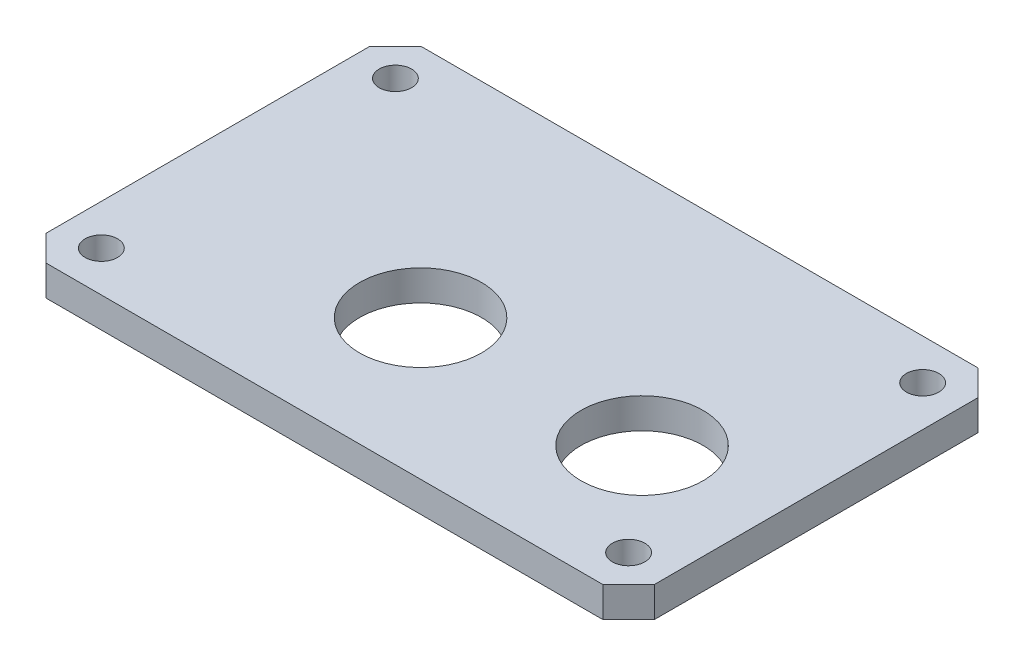
ISO-10303-21;
HEADER;
FILE_DESCRIPTION(('STEP AP214'),'2;1');
FILE_NAME('part.step','',(''),(''),'','','');
FILE_SCHEMA(('AUTOMOTIVE_DESIGN { 1 0 10303 214 1 1 1 1 }'));
ENDSEC;
DATA;
#1=APPLICATION_CONTEXT('core data for automotive mechanical design processes');
#2=APPLICATION_PROTOCOL_DEFINITION('international standard','automotive_design',2000,#1);
#3=PRODUCT_CONTEXT('',#1,'mechanical');
#4=PRODUCT('Part','Part','',(#3));
#5=PRODUCT_RELATED_PRODUCT_CATEGORY('part','',(#4));
#6=PRODUCT_DEFINITION_FORMATION('','',#4);
#7=PRODUCT_DEFINITION_CONTEXT('part definition',#1,'design');
#8=PRODUCT_DEFINITION('design','',#6,#7);
#9=PRODUCT_DEFINITION_SHAPE('','',#8);
#10=(LENGTH_UNIT() NAMED_UNIT(*) SI_UNIT(.MILLI.,.METRE.));
#11=(NAMED_UNIT(*) PLANE_ANGLE_UNIT() SI_UNIT($,.RADIAN.));
#12=(NAMED_UNIT(*) SI_UNIT($,.STERADIAN.) SOLID_ANGLE_UNIT());
#13=UNCERTAINTY_MEASURE_WITH_UNIT(LENGTH_MEASURE(1.E-05),#10,'distance_accuracy_value','');
#14=(GEOMETRIC_REPRESENTATION_CONTEXT(3) GLOBAL_UNCERTAINTY_ASSIGNED_CONTEXT((#13)) GLOBAL_UNIT_ASSIGNED_CONTEXT((#10,
#11,#12)) REPRESENTATION_CONTEXT('',''));
#15=CARTESIAN_POINT('',(0.,0.,0.));
#16=DIRECTION('',(0.,0.,1.));
#17=DIRECTION('',(1.,0.,0.));
#18=AXIS2_PLACEMENT_3D('',#15,#16,#17);
#19=CARTESIAN_POINT('',(30.,2.9972,18.5));
#20=DIRECTION('',(-1.,0.,0.));
#21=DIRECTION('',(0.,0.,1.));
#22=AXIS2_PLACEMENT_3D('',#19,#20,#21);
#23=PLANE('',#22);
#24=DIRECTION('',(0.,0.,-1.));
#25=VECTOR('',#24,1.);
#26=CARTESIAN_POINT('',(30.,0.,18.5));
#27=LINE('',#26,#25);
#28=CARTESIAN_POINT('',(30.,0.,15.96));
#29=VERTEX_POINT('',#28);
#30=CARTESIAN_POINT('',(30.,0.,-15.96));
#31=VERTEX_POINT('',#30);
#32=EDGE_CURVE('E126',#29,#31,#27,.T.);
#33=ORIENTED_EDGE('',*,*,#32,.T.);
#34=DIRECTION('',(0.,1.,0.));
#35=VECTOR('',#34,1.);
#36=CARTESIAN_POINT('',(30.,2.9972,-15.96));
#37=LINE('',#36,#35);
#38=CARTESIAN_POINT('',(30.,2.9972,-15.96));
#39=VERTEX_POINT('',#38);
#40=EDGE_CURVE('E104',#31,#39,#37,.T.);
#41=ORIENTED_EDGE('',*,*,#40,.T.);
#42=DIRECTION('',(0.,0.,-1.));
#43=VECTOR('',#42,1.);
#44=CARTESIAN_POINT('',(30.,2.9972,18.5));
#45=LINE('',#44,#43);
#46=CARTESIAN_POINT('',(30.,2.9972,15.96));
#47=VERTEX_POINT('',#46);
#48=EDGE_CURVE('E136',#47,#39,#45,.T.);
#49=ORIENTED_EDGE('',*,*,#48,.F.);
#50=DIRECTION('',(0.,-1.,0.));
#51=VECTOR('',#50,1.);
#52=CARTESIAN_POINT('',(30.,2.9972,15.96));
#53=LINE('',#52,#51);
#54=EDGE_CURVE('E109',#47,#29,#53,.T.);
#55=ORIENTED_EDGE('',*,*,#54,.T.);
#56=EDGE_LOOP('',(#33,#41,#49,#55));
#57=FACE_BOUND('',#56,.T.);
#58=ADVANCED_FACE('F33',(#57),#23,.F.);
#59=CARTESIAN_POINT('',(-30.,2.9972,-18.5));
#60=DIRECTION('',(0.,0.,1.));
#61=DIRECTION('',(1.,0.,0.));
#62=AXIS2_PLACEMENT_3D('',#59,#60,#61);
#63=PLANE('',#62);
#64=DIRECTION('',(-1.,0.,0.));
#65=VECTOR('',#64,1.);
#66=CARTESIAN_POINT('',(-30.,2.9972,-18.5));
#67=LINE('',#66,#65);
#68=CARTESIAN_POINT('',(27.46,2.9972,-18.5));
#69=VERTEX_POINT('',#68);
#70=CARTESIAN_POINT('',(-27.46,2.9972,-18.5));
#71=VERTEX_POINT('',#70);
#72=EDGE_CURVE('E119',#69,#71,#67,.T.);
#73=ORIENTED_EDGE('',*,*,#72,.F.);
#74=DIRECTION('',(0.,-1.,0.));
#75=VECTOR('',#74,1.);
#76=CARTESIAN_POINT('',(27.46,2.9972,-18.5));
#77=LINE('',#76,#75);
#78=CARTESIAN_POINT('',(27.46,0.,-18.5));
#79=VERTEX_POINT('',#78);
#80=EDGE_CURVE('E103',#69,#79,#77,.T.);
#81=ORIENTED_EDGE('',*,*,#80,.T.);
#82=DIRECTION('',(-1.,0.,0.));
#83=VECTOR('',#82,1.);
#84=CARTESIAN_POINT('',(-30.,0.,-18.5));
#85=LINE('',#84,#83);
#86=CARTESIAN_POINT('',(-27.46,0.,-18.5));
#87=VERTEX_POINT('',#86);
#88=EDGE_CURVE('E116',#79,#87,#85,.T.);
#89=ORIENTED_EDGE('',*,*,#88,.T.);
#90=DIRECTION('',(0.,1.,0.));
#91=VECTOR('',#90,1.);
#92=CARTESIAN_POINT('',(-27.46,2.9972,-18.5));
#93=LINE('',#92,#91);
#94=EDGE_CURVE('E121',#87,#71,#93,.T.);
#95=ORIENTED_EDGE('',*,*,#94,.T.);
#96=EDGE_LOOP('',(#73,#81,#89,#95));
#97=FACE_BOUND('',#96,.T.);
#98=ADVANCED_FACE('F115',(#97),#63,.F.);
#99=CARTESIAN_POINT('',(-30.,2.9972,18.5));
#100=DIRECTION('',(1.,0.,0.));
#101=DIRECTION('',(0.,0.,-1.));
#102=AXIS2_PLACEMENT_3D('',#99,#100,#101);
#103=PLANE('',#102);
#104=DIRECTION('',(0.,0.,1.));
#105=VECTOR('',#104,1.);
#106=CARTESIAN_POINT('',(-30.,0.,18.5));
#107=LINE('',#106,#105);
#108=CARTESIAN_POINT('',(-30.,0.,-15.96));
#109=VERTEX_POINT('',#108);
#110=CARTESIAN_POINT('',(-30.,0.,15.96));
#111=VERTEX_POINT('',#110);
#112=EDGE_CURVE('E125',#109,#111,#107,.T.);
#113=ORIENTED_EDGE('',*,*,#112,.T.);
#114=DIRECTION('',(0.,1.,0.));
#115=VECTOR('',#114,1.);
#116=CARTESIAN_POINT('',(-30.,2.9972,15.96));
#117=LINE('',#116,#115);
#118=CARTESIAN_POINT('',(-30.,2.9972,15.96));
#119=VERTEX_POINT('',#118);
#120=EDGE_CURVE('E11',#111,#119,#117,.T.);
#121=ORIENTED_EDGE('',*,*,#120,.T.);
#122=DIRECTION('',(0.,0.,1.));
#123=VECTOR('',#122,1.);
#124=CARTESIAN_POINT('',(-30.,2.9972,18.5));
#125=LINE('',#124,#123);
#126=CARTESIAN_POINT('',(-30.,2.9972,-15.96));
#127=VERTEX_POINT('',#126);
#128=EDGE_CURVE('E162',#127,#119,#125,.T.);
#129=ORIENTED_EDGE('',*,*,#128,.F.);
#130=DIRECTION('',(0.,-1.,0.));
#131=VECTOR('',#130,1.);
#132=CARTESIAN_POINT('',(-30.,2.9972,-15.96));
#133=LINE('',#132,#131);
#134=EDGE_CURVE('E41',#127,#109,#133,.T.);
#135=ORIENTED_EDGE('',*,*,#134,.T.);
#136=EDGE_LOOP('',(#113,#121,#129,#135));
#137=FACE_BOUND('',#136,.T.);
#138=ADVANCED_FACE('F160',(#137),#103,.F.);
#139=CARTESIAN_POINT('',(-30.,2.9972,18.5));
#140=DIRECTION('',(0.,0.,-1.));
#141=DIRECTION('',(-1.,0.,0.));
#142=AXIS2_PLACEMENT_3D('',#139,#140,#141);
#143=PLANE('',#142);
#144=DIRECTION('',(1.,0.,0.));
#145=VECTOR('',#144,1.);
#146=CARTESIAN_POINT('',(-30.,0.,18.5));
#147=LINE('',#146,#145);
#148=CARTESIAN_POINT('',(-27.46,0.,18.5));
#149=VERTEX_POINT('',#148);
#150=CARTESIAN_POINT('',(27.46,0.,18.5));
#151=VERTEX_POINT('',#150);
#152=EDGE_CURVE('E129',#149,#151,#147,.T.);
#153=ORIENTED_EDGE('',*,*,#152,.T.);
#154=DIRECTION('',(0.,1.,0.));
#155=VECTOR('',#154,1.);
#156=CARTESIAN_POINT('',(27.46,2.9972,18.5));
#157=LINE('',#156,#155);
#158=CARTESIAN_POINT('',(27.46,2.9972,18.5));
#159=VERTEX_POINT('',#158);
#160=EDGE_CURVE('E48',#151,#159,#157,.T.);
#161=ORIENTED_EDGE('',*,*,#160,.T.);
#162=DIRECTION('',(1.,0.,0.));
#163=VECTOR('',#162,1.);
#164=CARTESIAN_POINT('',(-30.,2.9972,18.5));
#165=LINE('',#164,#163);
#166=CARTESIAN_POINT('',(-27.46,2.9972,18.5));
#167=VERTEX_POINT('',#166);
#168=EDGE_CURVE('E137',#167,#159,#165,.T.);
#169=ORIENTED_EDGE('',*,*,#168,.F.);
#170=DIRECTION('',(0.,-1.,0.));
#171=VECTOR('',#170,1.);
#172=CARTESIAN_POINT('',(-27.46,2.9972,18.5));
#173=LINE('',#172,#171);
#174=EDGE_CURVE('E153',#167,#149,#173,.T.);
#175=ORIENTED_EDGE('',*,*,#174,.T.);
#176=EDGE_LOOP('',(#153,#161,#169,#175));
#177=FACE_BOUND('',#176,.T.);
#178=ADVANCED_FACE('F169',(#177),#143,.F.);
#179=CARTESIAN_POINT('',(30.,2.9972,-18.5));
#180=DIRECTION('',(0.,-1.,0.));
#181=DIRECTION('',(0.,0.,-1.));
#182=AXIS2_PLACEMENT_3D('',#179,#180,#181);
#183=PLANE('',#182);
#184=CARTESIAN_POINT('',(17.526,2.9972,4.699));
#185=DIRECTION('',(0.,1.,0.));
#186=DIRECTION('',(0.,0.,1.));
#187=AXIS2_PLACEMENT_3D('',#184,#185,#186);
#188=CIRCLE('',#187,6.0198);
#189=CARTESIAN_POINT('',(17.526,2.9972,10.7188));
#190=VERTEX_POINT('',#189);
#191=EDGE_CURVE('E206',#190,#190,#188,.T.);
#192=ORIENTED_EDGE('',*,*,#191,.F.);
#193=EDGE_LOOP('',(#192));
#194=FACE_BOUND('',#193,.T.);
#195=CARTESIAN_POINT('',(-4.318,2.9972,4.699));
#196=DIRECTION('',(0.,1.,0.));
#197=DIRECTION('',(0.,0.,1.));
#198=AXIS2_PLACEMENT_3D('',#195,#196,#197);
#199=CIRCLE('',#198,6.0198);
#200=CARTESIAN_POINT('',(-4.318,2.9972,10.7188));
#201=VERTEX_POINT('',#200);
#202=EDGE_CURVE('E200',#201,#201,#199,.T.);
#203=ORIENTED_EDGE('',*,*,#202,.F.);
#204=EDGE_LOOP('',(#203));
#205=FACE_BOUND('',#204,.T.);
#206=CARTESIAN_POINT('',(26.,2.9972,-14.5));
#207=DIRECTION('',(0.,1.,0.));
#208=DIRECTION('',(0.,0.,1.));
#209=AXIS2_PLACEMENT_3D('',#206,#207,#208);
#210=CIRCLE('',#209,1.6);
#211=CARTESIAN_POINT('',(26.,2.9972,-12.9));
#212=VERTEX_POINT('',#211);
#213=EDGE_CURVE('E194',#212,#212,#210,.T.);
#214=ORIENTED_EDGE('',*,*,#213,.F.);
#215=EDGE_LOOP('',(#214));
#216=FACE_BOUND('',#215,.T.);
#217=CARTESIAN_POINT('',(26.,2.9972,14.5));
#218=DIRECTION('',(0.,1.,0.));
#219=DIRECTION('',(0.,0.,1.));
#220=AXIS2_PLACEMENT_3D('',#217,#218,#219);
#221=CIRCLE('',#220,1.6);
#222=CARTESIAN_POINT('',(26.,2.9972,16.1));
#223=VERTEX_POINT('',#222);
#224=EDGE_CURVE('E188',#223,#223,#221,.T.);
#225=ORIENTED_EDGE('',*,*,#224,.F.);
#226=EDGE_LOOP('',(#225));
#227=FACE_BOUND('',#226,.T.);
#228=CARTESIAN_POINT('',(-26.,2.9972,14.5));
#229=DIRECTION('',(0.,1.,0.));
#230=DIRECTION('',(0.,0.,1.));
#231=AXIS2_PLACEMENT_3D('',#228,#229,#230);
#232=CIRCLE('',#231,1.6);
#233=CARTESIAN_POINT('',(-26.,2.9972,16.1));
#234=VERTEX_POINT('',#233);
#235=EDGE_CURVE('E182',#234,#234,#232,.T.);
#236=ORIENTED_EDGE('',*,*,#235,.F.);
#237=EDGE_LOOP('',(#236));
#238=FACE_BOUND('',#237,.T.);
#239=CARTESIAN_POINT('',(-26.,2.9972,-14.5));
#240=DIRECTION('',(0.,1.,0.));
#241=DIRECTION('',(0.,0.,1.));
#242=AXIS2_PLACEMENT_3D('',#239,#240,#241);
#243=CIRCLE('',#242,1.6);
#244=CARTESIAN_POINT('',(-26.,2.9972,-12.9));
#245=VERTEX_POINT('',#244);
#246=EDGE_CURVE('E176',#245,#245,#243,.T.);
#247=ORIENTED_EDGE('',*,*,#246,.F.);
#248=EDGE_LOOP('',(#247));
#249=FACE_BOUND('',#248,.T.);
#250=ORIENTED_EDGE('',*,*,#48,.T.);
#251=DIRECTION('',(0.707106781186545,0.,0.70710678118655));
#252=VECTOR('',#251,1.);
#253=CARTESIAN_POINT('',(27.46,2.9972,-18.5));
#254=LINE('',#253,#252);
#255=EDGE_CURVE('E151',#39,#69,#254,.F.);
#256=ORIENTED_EDGE('',*,*,#255,.T.);
#257=ORIENTED_EDGE('',*,*,#72,.T.);
#258=DIRECTION('',(0.707106781186549,0.,-0.707106781186547));
#259=VECTOR('',#258,1.);
#260=CARTESIAN_POINT('',(-30.,2.9972,-15.96));
#261=LINE('',#260,#259);
#262=EDGE_CURVE('E146',#71,#127,#261,.F.);
#263=ORIENTED_EDGE('',*,*,#262,.T.);
#264=ORIENTED_EDGE('',*,*,#128,.T.);
#265=DIRECTION('',(-0.707106781186546,0.,-0.70710678118655));
#266=VECTOR('',#265,1.);
#267=CARTESIAN_POINT('',(-27.46,2.9972,18.5));
#268=LINE('',#267,#266);
#269=EDGE_CURVE('E55',#119,#167,#268,.F.);
#270=ORIENTED_EDGE('',*,*,#269,.T.);
#271=ORIENTED_EDGE('',*,*,#168,.T.);
#272=DIRECTION('',(-0.70710678118655,0.,0.707106781186546));
#273=VECTOR('',#272,1.);
#274=CARTESIAN_POINT('',(30.,2.9972,15.96));
#275=LINE('',#274,#273);
#276=EDGE_CURVE('E149',#159,#47,#275,.F.);
#277=ORIENTED_EDGE('',*,*,#276,.T.);
#278=EDGE_LOOP('',(#250,#256,#257,#263,#264,#270,#271,#277));
#279=FACE_BOUND('',#278,.T.);
#280=ADVANCED_FACE('F221',(#194,#205,#216,#227,#238,#249,#279),#183,.F.);
#281=CARTESIAN_POINT('',(30.,0.,-18.5));
#282=DIRECTION('',(0.,-1.,0.));
#283=DIRECTION('',(0.,0.,-1.));
#284=AXIS2_PLACEMENT_3D('',#281,#282,#283);
#285=PLANE('',#284);
#286=CARTESIAN_POINT('',(17.526,0.,4.699));
#287=DIRECTION('',(0.,1.,0.));
#288=DIRECTION('',(0.,0.,1.));
#289=AXIS2_PLACEMENT_3D('',#286,#287,#288);
#290=CIRCLE('',#289,6.0198);
#291=CARTESIAN_POINT('',(17.526,0.,10.7188));
#292=VERTEX_POINT('',#291);
#293=EDGE_CURVE('E203',#292,#292,#290,.T.);
#294=ORIENTED_EDGE('',*,*,#293,.T.);
#295=EDGE_LOOP('',(#294));
#296=FACE_BOUND('',#295,.T.);
#297=CARTESIAN_POINT('',(-4.318,0.,4.699));
#298=DIRECTION('',(0.,1.,0.));
#299=DIRECTION('',(0.,0.,1.));
#300=AXIS2_PLACEMENT_3D('',#297,#298,#299);
#301=CIRCLE('',#300,6.0198);
#302=CARTESIAN_POINT('',(-4.318,0.,10.7188));
#303=VERTEX_POINT('',#302);
#304=EDGE_CURVE('E197',#303,#303,#301,.T.);
#305=ORIENTED_EDGE('',*,*,#304,.T.);
#306=EDGE_LOOP('',(#305));
#307=FACE_BOUND('',#306,.T.);
#308=CARTESIAN_POINT('',(26.,0.,-14.5));
#309=DIRECTION('',(0.,1.,0.));
#310=DIRECTION('',(0.,0.,1.));
#311=AXIS2_PLACEMENT_3D('',#308,#309,#310);
#312=CIRCLE('',#311,1.6);
#313=CARTESIAN_POINT('',(26.,0.,-12.9));
#314=VERTEX_POINT('',#313);
#315=EDGE_CURVE('E191',#314,#314,#312,.T.);
#316=ORIENTED_EDGE('',*,*,#315,.T.);
#317=EDGE_LOOP('',(#316));
#318=FACE_BOUND('',#317,.T.);
#319=CARTESIAN_POINT('',(26.,0.,14.5));
#320=DIRECTION('',(0.,1.,0.));
#321=DIRECTION('',(0.,0.,1.));
#322=AXIS2_PLACEMENT_3D('',#319,#320,#321);
#323=CIRCLE('',#322,1.6);
#324=CARTESIAN_POINT('',(26.,0.,16.1));
#325=VERTEX_POINT('',#324);
#326=EDGE_CURVE('E185',#325,#325,#323,.T.);
#327=ORIENTED_EDGE('',*,*,#326,.T.);
#328=EDGE_LOOP('',(#327));
#329=FACE_BOUND('',#328,.T.);
#330=CARTESIAN_POINT('',(-26.,0.,14.5));
#331=DIRECTION('',(0.,1.,0.));
#332=DIRECTION('',(0.,0.,1.));
#333=AXIS2_PLACEMENT_3D('',#330,#331,#332);
#334=CIRCLE('',#333,1.6);
#335=CARTESIAN_POINT('',(-26.,0.,16.1));
#336=VERTEX_POINT('',#335);
#337=EDGE_CURVE('E179',#336,#336,#334,.T.);
#338=ORIENTED_EDGE('',*,*,#337,.T.);
#339=EDGE_LOOP('',(#338));
#340=FACE_BOUND('',#339,.T.);
#341=CARTESIAN_POINT('',(-26.,0.,-14.5));
#342=DIRECTION('',(0.,1.,0.));
#343=DIRECTION('',(0.,0.,1.));
#344=AXIS2_PLACEMENT_3D('',#341,#342,#343);
#345=CIRCLE('',#344,1.6);
#346=CARTESIAN_POINT('',(-26.,0.,-12.9));
#347=VERTEX_POINT('',#346);
#348=EDGE_CURVE('E131',#347,#347,#345,.T.);
#349=ORIENTED_EDGE('',*,*,#348,.T.);
#350=EDGE_LOOP('',(#349));
#351=FACE_BOUND('',#350,.T.);
#352=ORIENTED_EDGE('',*,*,#88,.F.);
#353=DIRECTION('',(-0.707106781186545,0.,-0.70710678118655));
#354=VECTOR('',#353,1.);
#355=CARTESIAN_POINT('',(28.73,0.,-17.23));
#356=LINE('',#355,#354);
#357=EDGE_CURVE('E99',#79,#31,#356,.F.);
#358=ORIENTED_EDGE('',*,*,#357,.T.);
#359=ORIENTED_EDGE('',*,*,#32,.F.);
#360=DIRECTION('',(0.70710678118655,0.,-0.707106781186546));
#361=VECTOR('',#360,1.);
#362=CARTESIAN_POINT('',(47.23,0.,-1.2699999999999));
#363=LINE('',#362,#361);
#364=EDGE_CURVE('E110',#29,#151,#363,.F.);
#365=ORIENTED_EDGE('',*,*,#364,.T.);
#366=ORIENTED_EDGE('',*,*,#152,.F.);
#367=DIRECTION('',(0.707106781186546,0.,0.70710678118655));
#368=VECTOR('',#367,1.);
#369=CARTESIAN_POINT('',(-17.2300000000002,0.,28.7299999999999));
#370=LINE('',#369,#368);
#371=EDGE_CURVE('E140',#149,#111,#370,.F.);
#372=ORIENTED_EDGE('',*,*,#371,.T.);
#373=ORIENTED_EDGE('',*,*,#112,.F.);
#374=DIRECTION('',(-0.707106781186549,0.,0.707106781186547));
#375=VECTOR('',#374,1.);
#376=CARTESIAN_POINT('',(1.27000000000009,0.,-47.23));
#377=LINE('',#376,#375);
#378=EDGE_CURVE('E120',#109,#87,#377,.F.);
#379=ORIENTED_EDGE('',*,*,#378,.T.);
#380=EDGE_LOOP('',(#352,#358,#359,#365,#366,#372,#373,#379));
#381=FACE_BOUND('',#380,.T.);
#382=ADVANCED_FACE('F123',(#296,#307,#318,#329,#340,#351,#381),#285,.T.);
#383=CARTESIAN_POINT('',(-26.,0.,-14.5));
#384=DIRECTION('',(0.,1.,0.));
#385=DIRECTION('',(0.,0.,1.));
#386=AXIS2_PLACEMENT_3D('',#383,#384,#385);
#387=CYLINDRICAL_SURFACE('',#386,1.6);
#388=CARTESIAN_POINT('',(-26.,0.,-12.9));
#389=CARTESIAN_POINT('',(-26.,0.0312208333333333,-12.9));
#390=CARTESIAN_POINT('',(-26.,0.0624416666666667,-12.9));
#391=CARTESIAN_POINT('',(-26.,0.124883333333333,-12.9));
#392=CARTESIAN_POINT('',(-26.,0.156104166666667,-12.9));
#393=CARTESIAN_POINT('',(-26.,0.218545833333333,-12.9));
#394=CARTESIAN_POINT('',(-26.,0.249766666666667,-12.9));
#395=CARTESIAN_POINT('',(-26.,0.312208333333333,-12.9));
#396=CARTESIAN_POINT('',(-26.,0.343429166666667,-12.9));
#397=CARTESIAN_POINT('',(-26.,0.405870833333333,-12.9));
#398=CARTESIAN_POINT('',(-26.,0.437091666666667,-12.9));
#399=CARTESIAN_POINT('',(-26.,0.499533333333333,-12.9));
#400=CARTESIAN_POINT('',(-26.,0.530754166666667,-12.9));
#401=CARTESIAN_POINT('',(-26.,0.593195833333333,-12.9));
#402=CARTESIAN_POINT('',(-26.,0.624416666666667,-12.9));
#403=CARTESIAN_POINT('',(-26.,0.686858333333333,-12.9));
#404=CARTESIAN_POINT('',(-26.,0.718079166666667,-12.9));
#405=CARTESIAN_POINT('',(-26.,0.780520833333333,-12.9));
#406=CARTESIAN_POINT('',(-26.,0.811741666666667,-12.9));
#407=CARTESIAN_POINT('',(-26.,0.874183333333333,-12.9));
#408=CARTESIAN_POINT('',(-26.,0.905404166666667,-12.9));
#409=CARTESIAN_POINT('',(-26.,0.967845833333333,-12.9));
#410=CARTESIAN_POINT('',(-26.,0.999066666666667,-12.9));
#411=CARTESIAN_POINT('',(-26.,1.06150833333333,-12.9));
#412=CARTESIAN_POINT('',(-26.,1.09272916666667,-12.9));
#413=CARTESIAN_POINT('',(-26.,1.15517083333333,-12.9));
#414=CARTESIAN_POINT('',(-26.,1.18639166666667,-12.9));
#415=CARTESIAN_POINT('',(-26.,1.24883333333333,-12.9));
#416=CARTESIAN_POINT('',(-26.,1.28005416666667,-12.9));
#417=CARTESIAN_POINT('',(-26.,1.34249583333333,-12.9));
#418=CARTESIAN_POINT('',(-26.,1.37371666666667,-12.9));
#419=CARTESIAN_POINT('',(-26.,1.43615833333333,-12.9));
#420=CARTESIAN_POINT('',(-26.,1.46737916666667,-12.9));
#421=CARTESIAN_POINT('',(-26.,1.52982083333333,-12.9));
#422=CARTESIAN_POINT('',(-26.,1.56104166666667,-12.9));
#423=CARTESIAN_POINT('',(-26.,1.62348333333333,-12.9));
#424=CARTESIAN_POINT('',(-26.,1.65470416666667,-12.9));
#425=CARTESIAN_POINT('',(-26.,1.71714583333333,-12.9));
#426=CARTESIAN_POINT('',(-26.,1.74836666666667,-12.9));
#427=CARTESIAN_POINT('',(-26.,1.81080833333333,-12.9));
#428=CARTESIAN_POINT('',(-26.,1.84202916666667,-12.9));
#429=CARTESIAN_POINT('',(-26.,1.90447083333333,-12.9));
#430=CARTESIAN_POINT('',(-26.,1.93569166666667,-12.9));
#431=CARTESIAN_POINT('',(-26.,1.99813333333333,-12.9));
#432=CARTESIAN_POINT('',(-26.,2.02935416666667,-12.9));
#433=CARTESIAN_POINT('',(-26.,2.09179583333333,-12.9));
#434=CARTESIAN_POINT('',(-26.,2.12301666666667,-12.9));
#435=CARTESIAN_POINT('',(-26.,2.18545833333333,-12.9));
#436=CARTESIAN_POINT('',(-26.,2.21667916666667,-12.9));
#437=CARTESIAN_POINT('',(-26.,2.27912083333333,-12.9));
#438=CARTESIAN_POINT('',(-26.,2.31034166666667,-12.9));
#439=CARTESIAN_POINT('',(-26.,2.37278333333333,-12.9));
#440=CARTESIAN_POINT('',(-26.,2.40400416666667,-12.9));
#441=CARTESIAN_POINT('',(-26.,2.46644583333333,-12.9));
#442=CARTESIAN_POINT('',(-26.,2.49766666666667,-12.9));
#443=CARTESIAN_POINT('',(-26.,2.56010833333333,-12.9));
#444=CARTESIAN_POINT('',(-26.,2.59132916666667,-12.9));
#445=CARTESIAN_POINT('',(-26.,2.65377083333333,-12.9));
#446=CARTESIAN_POINT('',(-26.,2.68499166666667,-12.9));
#447=CARTESIAN_POINT('',(-26.,2.74743333333333,-12.9));
#448=CARTESIAN_POINT('',(-26.,2.77865416666667,-12.9));
#449=CARTESIAN_POINT('',(-26.,2.84109583333333,-12.9));
#450=CARTESIAN_POINT('',(-26.,2.87231666666667,-12.9));
#451=CARTESIAN_POINT('',(-26.,2.93475833333333,-12.9));
#452=CARTESIAN_POINT('',(-26.,2.96597916666667,-12.9));
#453=CARTESIAN_POINT('',(-26.,2.9972,-12.9));
#454=B_SPLINE_CURVE_WITH_KNOTS('',3,(#388,#389,#390,#391,#392,#393,#394,#395,#396,#397,#398,
#399,#400,#401,#402,#403,#404,#405,#406,#407,#408,#409,#410,#411,#412,#413,#414,#415,#416,#417,
#418,#419,#420,#421,#422,#423,#424,#425,#426,#427,#428,#429,#430,#431,#432,#433,#434,#435,#436,
#437,#438,#439,#440,#441,#442,#443,#444,#445,#446,#447,#448,#449,#450,#451,#452,#453),
.UNSPECIFIED.,.F.,.F.,(4,2,2,2,2,2,2,2,2,2,2,2,2,2,2,2,2,2,2,2,2,2,2,2,2,2,2,2,2,2,2,2,4),(0.,
0.0936625,0.187325,0.2809875,0.37465,0.4683125,0.561975,0.6556375,0.7493,0.8429625,0.936625,
1.0302875,1.12395,1.2176125,1.311275,1.4049375,1.4986,1.5922625,1.685925,1.7795875,1.87325,
1.9669125,2.060575,2.1542375,2.2479,2.3415625,2.435225,2.5288875,2.62255,2.7162125,2.809875,
2.9035375,2.9972),.UNSPECIFIED.);
#455=EDGE_CURVE('BSEAM258',#347,#245,#454,.T.);
#456=ORIENTED_EDGE('',*,*,#348,.F.);
#457=ORIENTED_EDGE('',*,*,#246,.T.);
#458=ORIENTED_EDGE('',*,*,#455,.T.);
#459=ORIENTED_EDGE('',*,*,#455,.F.);
#460=EDGE_LOOP('',(#456,#458,#457,#459));
#461=FACE_BOUND('',#460,.T.);
#462=ADVANCED_FACE('F258',(#461),#387,.F.);
#463=CARTESIAN_POINT('',(-26.,0.,14.5));
#464=DIRECTION('',(0.,1.,0.));
#465=DIRECTION('',(0.,0.,1.));
#466=AXIS2_PLACEMENT_3D('',#463,#464,#465);
#467=CYLINDRICAL_SURFACE('',#466,1.6);
#468=CARTESIAN_POINT('',(-26.,0.,16.1));
#469=CARTESIAN_POINT('',(-26.,0.0312208333333333,16.1));
#470=CARTESIAN_POINT('',(-26.,0.0624416666666667,16.1));
#471=CARTESIAN_POINT('',(-26.,0.124883333333333,16.1));
#472=CARTESIAN_POINT('',(-26.,0.156104166666667,16.1));
#473=CARTESIAN_POINT('',(-26.,0.218545833333333,16.1));
#474=CARTESIAN_POINT('',(-26.,0.249766666666667,16.1));
#475=CARTESIAN_POINT('',(-26.,0.312208333333333,16.1));
#476=CARTESIAN_POINT('',(-26.,0.343429166666667,16.1));
#477=CARTESIAN_POINT('',(-26.,0.405870833333333,16.1));
#478=CARTESIAN_POINT('',(-26.,0.437091666666667,16.1));
#479=CARTESIAN_POINT('',(-26.,0.499533333333333,16.1));
#480=CARTESIAN_POINT('',(-26.,0.530754166666667,16.1));
#481=CARTESIAN_POINT('',(-26.,0.593195833333333,16.1));
#482=CARTESIAN_POINT('',(-26.,0.624416666666667,16.1));
#483=CARTESIAN_POINT('',(-26.,0.686858333333333,16.1));
#484=CARTESIAN_POINT('',(-26.,0.718079166666667,16.1));
#485=CARTESIAN_POINT('',(-26.,0.780520833333333,16.1));
#486=CARTESIAN_POINT('',(-26.,0.811741666666667,16.1));
#487=CARTESIAN_POINT('',(-26.,0.874183333333333,16.1));
#488=CARTESIAN_POINT('',(-26.,0.905404166666667,16.1));
#489=CARTESIAN_POINT('',(-26.,0.967845833333333,16.1));
#490=CARTESIAN_POINT('',(-26.,0.999066666666667,16.1));
#491=CARTESIAN_POINT('',(-26.,1.06150833333333,16.1));
#492=CARTESIAN_POINT('',(-26.,1.09272916666667,16.1));
#493=CARTESIAN_POINT('',(-26.,1.15517083333333,16.1));
#494=CARTESIAN_POINT('',(-26.,1.18639166666667,16.1));
#495=CARTESIAN_POINT('',(-26.,1.24883333333333,16.1));
#496=CARTESIAN_POINT('',(-26.,1.28005416666667,16.1));
#497=CARTESIAN_POINT('',(-26.,1.34249583333333,16.1));
#498=CARTESIAN_POINT('',(-26.,1.37371666666667,16.1));
#499=CARTESIAN_POINT('',(-26.,1.43615833333333,16.1));
#500=CARTESIAN_POINT('',(-26.,1.46737916666667,16.1));
#501=CARTESIAN_POINT('',(-26.,1.52982083333333,16.1));
#502=CARTESIAN_POINT('',(-26.,1.56104166666667,16.1));
#503=CARTESIAN_POINT('',(-26.,1.62348333333333,16.1));
#504=CARTESIAN_POINT('',(-26.,1.65470416666667,16.1));
#505=CARTESIAN_POINT('',(-26.,1.71714583333333,16.1));
#506=CARTESIAN_POINT('',(-26.,1.74836666666667,16.1));
#507=CARTESIAN_POINT('',(-26.,1.81080833333333,16.1));
#508=CARTESIAN_POINT('',(-26.,1.84202916666667,16.1));
#509=CARTESIAN_POINT('',(-26.,1.90447083333333,16.1));
#510=CARTESIAN_POINT('',(-26.,1.93569166666667,16.1));
#511=CARTESIAN_POINT('',(-26.,1.99813333333333,16.1));
#512=CARTESIAN_POINT('',(-26.,2.02935416666667,16.1));
#513=CARTESIAN_POINT('',(-26.,2.09179583333333,16.1));
#514=CARTESIAN_POINT('',(-26.,2.12301666666667,16.1));
#515=CARTESIAN_POINT('',(-26.,2.18545833333333,16.1));
#516=CARTESIAN_POINT('',(-26.,2.21667916666667,16.1));
#517=CARTESIAN_POINT('',(-26.,2.27912083333333,16.1));
#518=CARTESIAN_POINT('',(-26.,2.31034166666667,16.1));
#519=CARTESIAN_POINT('',(-26.,2.37278333333333,16.1));
#520=CARTESIAN_POINT('',(-26.,2.40400416666667,16.1));
#521=CARTESIAN_POINT('',(-26.,2.46644583333333,16.1));
#522=CARTESIAN_POINT('',(-26.,2.49766666666667,16.1));
#523=CARTESIAN_POINT('',(-26.,2.56010833333333,16.1));
#524=CARTESIAN_POINT('',(-26.,2.59132916666667,16.1));
#525=CARTESIAN_POINT('',(-26.,2.65377083333333,16.1));
#526=CARTESIAN_POINT('',(-26.,2.68499166666667,16.1));
#527=CARTESIAN_POINT('',(-26.,2.74743333333333,16.1));
#528=CARTESIAN_POINT('',(-26.,2.77865416666667,16.1));
#529=CARTESIAN_POINT('',(-26.,2.84109583333333,16.1));
#530=CARTESIAN_POINT('',(-26.,2.87231666666667,16.1));
#531=CARTESIAN_POINT('',(-26.,2.93475833333333,16.1));
#532=CARTESIAN_POINT('',(-26.,2.96597916666667,16.1));
#533=CARTESIAN_POINT('',(-26.,2.9972,16.1));
#534=B_SPLINE_CURVE_WITH_KNOTS('',3,(#468,#469,#470,#471,#472,#473,#474,#475,#476,#477,#478,
#479,#480,#481,#482,#483,#484,#485,#486,#487,#488,#489,#490,#491,#492,#493,#494,#495,#496,#497,
#498,#499,#500,#501,#502,#503,#504,#505,#506,#507,#508,#509,#510,#511,#512,#513,#514,#515,#516,
#517,#518,#519,#520,#521,#522,#523,#524,#525,#526,#527,#528,#529,#530,#531,#532,#533),
.UNSPECIFIED.,.F.,.F.,(4,2,2,2,2,2,2,2,2,2,2,2,2,2,2,2,2,2,2,2,2,2,2,2,2,2,2,2,2,2,2,2,4),(0.,
0.0936625,0.187325,0.2809875,0.37465,0.4683125,0.561975,0.6556375,0.7493,0.8429625,0.936625,
1.0302875,1.12395,1.2176125,1.311275,1.4049375,1.4986,1.5922625,1.685925,1.7795875,1.87325,
1.9669125,2.060575,2.1542375,2.2479,2.3415625,2.435225,2.5288875,2.62255,2.7162125,2.809875,
2.9035375,2.9972),.UNSPECIFIED.);
#535=EDGE_CURVE('BSEAM262',#336,#234,#534,.T.);
#536=ORIENTED_EDGE('',*,*,#337,.F.);
#537=ORIENTED_EDGE('',*,*,#235,.T.);
#538=ORIENTED_EDGE('',*,*,#535,.T.);
#539=ORIENTED_EDGE('',*,*,#535,.F.);
#540=EDGE_LOOP('',(#536,#538,#537,#539));
#541=FACE_BOUND('',#540,.T.);
#542=ADVANCED_FACE('F262',(#541),#467,.F.);
#543=CARTESIAN_POINT('',(26.,0.,14.5));
#544=DIRECTION('',(0.,1.,0.));
#545=DIRECTION('',(0.,0.,1.));
#546=AXIS2_PLACEMENT_3D('',#543,#544,#545);
#547=CYLINDRICAL_SURFACE('',#546,1.6);
#548=CARTESIAN_POINT('',(26.,0.,16.1));
#549=CARTESIAN_POINT('',(26.,0.0312208333333333,16.1));
#550=CARTESIAN_POINT('',(26.,0.0624416666666667,16.1));
#551=CARTESIAN_POINT('',(26.,0.124883333333333,16.1));
#552=CARTESIAN_POINT('',(26.,0.156104166666667,16.1));
#553=CARTESIAN_POINT('',(26.,0.218545833333333,16.1));
#554=CARTESIAN_POINT('',(26.,0.249766666666667,16.1));
#555=CARTESIAN_POINT('',(26.,0.312208333333333,16.1));
#556=CARTESIAN_POINT('',(26.,0.343429166666667,16.1));
#557=CARTESIAN_POINT('',(26.,0.405870833333333,16.1));
#558=CARTESIAN_POINT('',(26.,0.437091666666667,16.1));
#559=CARTESIAN_POINT('',(26.,0.499533333333333,16.1));
#560=CARTESIAN_POINT('',(26.,0.530754166666667,16.1));
#561=CARTESIAN_POINT('',(26.,0.593195833333333,16.1));
#562=CARTESIAN_POINT('',(26.,0.624416666666667,16.1));
#563=CARTESIAN_POINT('',(26.,0.686858333333333,16.1));
#564=CARTESIAN_POINT('',(26.,0.718079166666667,16.1));
#565=CARTESIAN_POINT('',(26.,0.780520833333333,16.1));
#566=CARTESIAN_POINT('',(26.,0.811741666666667,16.1));
#567=CARTESIAN_POINT('',(26.,0.874183333333333,16.1));
#568=CARTESIAN_POINT('',(26.,0.905404166666667,16.1));
#569=CARTESIAN_POINT('',(26.,0.967845833333333,16.1));
#570=CARTESIAN_POINT('',(26.,0.999066666666667,16.1));
#571=CARTESIAN_POINT('',(26.,1.06150833333333,16.1));
#572=CARTESIAN_POINT('',(26.,1.09272916666667,16.1));
#573=CARTESIAN_POINT('',(26.,1.15517083333333,16.1));
#574=CARTESIAN_POINT('',(26.,1.18639166666667,16.1));
#575=CARTESIAN_POINT('',(26.,1.24883333333333,16.1));
#576=CARTESIAN_POINT('',(26.,1.28005416666667,16.1));
#577=CARTESIAN_POINT('',(26.,1.34249583333333,16.1));
#578=CARTESIAN_POINT('',(26.,1.37371666666667,16.1));
#579=CARTESIAN_POINT('',(26.,1.43615833333333,16.1));
#580=CARTESIAN_POINT('',(26.,1.46737916666667,16.1));
#581=CARTESIAN_POINT('',(26.,1.52982083333333,16.1));
#582=CARTESIAN_POINT('',(26.,1.56104166666667,16.1));
#583=CARTESIAN_POINT('',(26.,1.62348333333333,16.1));
#584=CARTESIAN_POINT('',(26.,1.65470416666667,16.1));
#585=CARTESIAN_POINT('',(26.,1.71714583333333,16.1));
#586=CARTESIAN_POINT('',(26.,1.74836666666667,16.1));
#587=CARTESIAN_POINT('',(26.,1.81080833333333,16.1));
#588=CARTESIAN_POINT('',(26.,1.84202916666667,16.1));
#589=CARTESIAN_POINT('',(26.,1.90447083333333,16.1));
#590=CARTESIAN_POINT('',(26.,1.93569166666667,16.1));
#591=CARTESIAN_POINT('',(26.,1.99813333333333,16.1));
#592=CARTESIAN_POINT('',(26.,2.02935416666667,16.1));
#593=CARTESIAN_POINT('',(26.,2.09179583333333,16.1));
#594=CARTESIAN_POINT('',(26.,2.12301666666667,16.1));
#595=CARTESIAN_POINT('',(26.,2.18545833333333,16.1));
#596=CARTESIAN_POINT('',(26.,2.21667916666667,16.1));
#597=CARTESIAN_POINT('',(26.,2.27912083333333,16.1));
#598=CARTESIAN_POINT('',(26.,2.31034166666667,16.1));
#599=CARTESIAN_POINT('',(26.,2.37278333333333,16.1));
#600=CARTESIAN_POINT('',(26.,2.40400416666667,16.1));
#601=CARTESIAN_POINT('',(26.,2.46644583333333,16.1));
#602=CARTESIAN_POINT('',(26.,2.49766666666667,16.1));
#603=CARTESIAN_POINT('',(26.,2.56010833333333,16.1));
#604=CARTESIAN_POINT('',(26.,2.59132916666667,16.1));
#605=CARTESIAN_POINT('',(26.,2.65377083333333,16.1));
#606=CARTESIAN_POINT('',(26.,2.68499166666667,16.1));
#607=CARTESIAN_POINT('',(26.,2.74743333333333,16.1));
#608=CARTESIAN_POINT('',(26.,2.77865416666667,16.1));
#609=CARTESIAN_POINT('',(26.,2.84109583333333,16.1));
#610=CARTESIAN_POINT('',(26.,2.87231666666667,16.1));
#611=CARTESIAN_POINT('',(26.,2.93475833333333,16.1));
#612=CARTESIAN_POINT('',(26.,2.96597916666667,16.1));
#613=CARTESIAN_POINT('',(26.,2.9972,16.1));
#614=B_SPLINE_CURVE_WITH_KNOTS('',3,(#548,#549,#550,#551,#552,#553,#554,#555,#556,#557,#558,
#559,#560,#561,#562,#563,#564,#565,#566,#567,#568,#569,#570,#571,#572,#573,#574,#575,#576,#577,
#578,#579,#580,#581,#582,#583,#584,#585,#586,#587,#588,#589,#590,#591,#592,#593,#594,#595,#596,
#597,#598,#599,#600,#601,#602,#603,#604,#605,#606,#607,#608,#609,#610,#611,#612,#613),
.UNSPECIFIED.,.F.,.F.,(4,2,2,2,2,2,2,2,2,2,2,2,2,2,2,2,2,2,2,2,2,2,2,2,2,2,2,2,2,2,2,2,4),(0.,
0.0936625,0.187325,0.2809875,0.37465,0.4683125,0.561975,0.6556375,0.7493,0.8429625,0.936625,
1.0302875,1.12395,1.2176125,1.311275,1.4049375,1.4986,1.5922625,1.685925,1.7795875,1.87325,
1.9669125,2.060575,2.1542375,2.2479,2.3415625,2.435225,2.5288875,2.62255,2.7162125,2.809875,
2.9035375,2.9972),.UNSPECIFIED.);
#615=EDGE_CURVE('BSEAM266',#325,#223,#614,.T.);
#616=ORIENTED_EDGE('',*,*,#326,.F.);
#617=ORIENTED_EDGE('',*,*,#224,.T.);
#618=ORIENTED_EDGE('',*,*,#615,.T.);
#619=ORIENTED_EDGE('',*,*,#615,.F.);
#620=EDGE_LOOP('',(#616,#618,#617,#619));
#621=FACE_BOUND('',#620,.T.);
#622=ADVANCED_FACE('F266',(#621),#547,.F.);
#623=CARTESIAN_POINT('',(26.,0.,-14.5));
#624=DIRECTION('',(0.,1.,0.));
#625=DIRECTION('',(0.,0.,1.));
#626=AXIS2_PLACEMENT_3D('',#623,#624,#625);
#627=CYLINDRICAL_SURFACE('',#626,1.6);
#628=CARTESIAN_POINT('',(26.,0.,-12.9));
#629=CARTESIAN_POINT('',(26.,0.0312208333333333,-12.9));
#630=CARTESIAN_POINT('',(26.,0.0624416666666667,-12.9));
#631=CARTESIAN_POINT('',(26.,0.124883333333333,-12.9));
#632=CARTESIAN_POINT('',(26.,0.156104166666667,-12.9));
#633=CARTESIAN_POINT('',(26.,0.218545833333333,-12.9));
#634=CARTESIAN_POINT('',(26.,0.249766666666667,-12.9));
#635=CARTESIAN_POINT('',(26.,0.312208333333333,-12.9));
#636=CARTESIAN_POINT('',(26.,0.343429166666667,-12.9));
#637=CARTESIAN_POINT('',(26.,0.405870833333333,-12.9));
#638=CARTESIAN_POINT('',(26.,0.437091666666667,-12.9));
#639=CARTESIAN_POINT('',(26.,0.499533333333333,-12.9));
#640=CARTESIAN_POINT('',(26.,0.530754166666667,-12.9));
#641=CARTESIAN_POINT('',(26.,0.593195833333333,-12.9));
#642=CARTESIAN_POINT('',(26.,0.624416666666667,-12.9));
#643=CARTESIAN_POINT('',(26.,0.686858333333333,-12.9));
#644=CARTESIAN_POINT('',(26.,0.718079166666667,-12.9));
#645=CARTESIAN_POINT('',(26.,0.780520833333333,-12.9));
#646=CARTESIAN_POINT('',(26.,0.811741666666667,-12.9));
#647=CARTESIAN_POINT('',(26.,0.874183333333333,-12.9));
#648=CARTESIAN_POINT('',(26.,0.905404166666667,-12.9));
#649=CARTESIAN_POINT('',(26.,0.967845833333333,-12.9));
#650=CARTESIAN_POINT('',(26.,0.999066666666667,-12.9));
#651=CARTESIAN_POINT('',(26.,1.06150833333333,-12.9));
#652=CARTESIAN_POINT('',(26.,1.09272916666667,-12.9));
#653=CARTESIAN_POINT('',(26.,1.15517083333333,-12.9));
#654=CARTESIAN_POINT('',(26.,1.18639166666667,-12.9));
#655=CARTESIAN_POINT('',(26.,1.24883333333333,-12.9));
#656=CARTESIAN_POINT('',(26.,1.28005416666667,-12.9));
#657=CARTESIAN_POINT('',(26.,1.34249583333333,-12.9));
#658=CARTESIAN_POINT('',(26.,1.37371666666667,-12.9));
#659=CARTESIAN_POINT('',(26.,1.43615833333333,-12.9));
#660=CARTESIAN_POINT('',(26.,1.46737916666667,-12.9));
#661=CARTESIAN_POINT('',(26.,1.52982083333333,-12.9));
#662=CARTESIAN_POINT('',(26.,1.56104166666667,-12.9));
#663=CARTESIAN_POINT('',(26.,1.62348333333333,-12.9));
#664=CARTESIAN_POINT('',(26.,1.65470416666667,-12.9));
#665=CARTESIAN_POINT('',(26.,1.71714583333333,-12.9));
#666=CARTESIAN_POINT('',(26.,1.74836666666667,-12.9));
#667=CARTESIAN_POINT('',(26.,1.81080833333333,-12.9));
#668=CARTESIAN_POINT('',(26.,1.84202916666667,-12.9));
#669=CARTESIAN_POINT('',(26.,1.90447083333333,-12.9));
#670=CARTESIAN_POINT('',(26.,1.93569166666667,-12.9));
#671=CARTESIAN_POINT('',(26.,1.99813333333333,-12.9));
#672=CARTESIAN_POINT('',(26.,2.02935416666667,-12.9));
#673=CARTESIAN_POINT('',(26.,2.09179583333333,-12.9));
#674=CARTESIAN_POINT('',(26.,2.12301666666667,-12.9));
#675=CARTESIAN_POINT('',(26.,2.18545833333333,-12.9));
#676=CARTESIAN_POINT('',(26.,2.21667916666667,-12.9));
#677=CARTESIAN_POINT('',(26.,2.27912083333333,-12.9));
#678=CARTESIAN_POINT('',(26.,2.31034166666667,-12.9));
#679=CARTESIAN_POINT('',(26.,2.37278333333333,-12.9));
#680=CARTESIAN_POINT('',(26.,2.40400416666667,-12.9));
#681=CARTESIAN_POINT('',(26.,2.46644583333333,-12.9));
#682=CARTESIAN_POINT('',(26.,2.49766666666667,-12.9));
#683=CARTESIAN_POINT('',(26.,2.56010833333333,-12.9));
#684=CARTESIAN_POINT('',(26.,2.59132916666667,-12.9));
#685=CARTESIAN_POINT('',(26.,2.65377083333333,-12.9));
#686=CARTESIAN_POINT('',(26.,2.68499166666667,-12.9));
#687=CARTESIAN_POINT('',(26.,2.74743333333333,-12.9));
#688=CARTESIAN_POINT('',(26.,2.77865416666667,-12.9));
#689=CARTESIAN_POINT('',(26.,2.84109583333333,-12.9));
#690=CARTESIAN_POINT('',(26.,2.87231666666667,-12.9));
#691=CARTESIAN_POINT('',(26.,2.93475833333333,-12.9));
#692=CARTESIAN_POINT('',(26.,2.96597916666667,-12.9));
#693=CARTESIAN_POINT('',(26.,2.9972,-12.9));
#694=B_SPLINE_CURVE_WITH_KNOTS('',3,(#628,#629,#630,#631,#632,#633,#634,#635,#636,#637,#638,
#639,#640,#641,#642,#643,#644,#645,#646,#647,#648,#649,#650,#651,#652,#653,#654,#655,#656,#657,
#658,#659,#660,#661,#662,#663,#664,#665,#666,#667,#668,#669,#670,#671,#672,#673,#674,#675,#676,
#677,#678,#679,#680,#681,#682,#683,#684,#685,#686,#687,#688,#689,#690,#691,#692,#693),
.UNSPECIFIED.,.F.,.F.,(4,2,2,2,2,2,2,2,2,2,2,2,2,2,2,2,2,2,2,2,2,2,2,2,2,2,2,2,2,2,2,2,4),(0.,
0.0936625,0.187325,0.2809875,0.37465,0.4683125,0.561975,0.6556375,0.7493,0.8429625,0.936625,
1.0302875,1.12395,1.2176125,1.311275,1.4049375,1.4986,1.5922625,1.685925,1.7795875,1.87325,
1.9669125,2.060575,2.1542375,2.2479,2.3415625,2.435225,2.5288875,2.62255,2.7162125,2.809875,
2.9035375,2.9972),.UNSPECIFIED.);
#695=EDGE_CURVE('BSEAM270',#314,#212,#694,.T.);
#696=ORIENTED_EDGE('',*,*,#315,.F.);
#697=ORIENTED_EDGE('',*,*,#213,.T.);
#698=ORIENTED_EDGE('',*,*,#695,.T.);
#699=ORIENTED_EDGE('',*,*,#695,.F.);
#700=EDGE_LOOP('',(#696,#698,#697,#699));
#701=FACE_BOUND('',#700,.T.);
#702=ADVANCED_FACE('F270',(#701),#627,.F.);
#703=CARTESIAN_POINT('',(-4.318,0.,4.699));
#704=DIRECTION('',(0.,1.,0.));
#705=DIRECTION('',(0.,0.,1.));
#706=AXIS2_PLACEMENT_3D('',#703,#704,#705);
#707=CYLINDRICAL_SURFACE('',#706,6.0198);
#708=CARTESIAN_POINT('',(-4.318,0.,10.7188));
#709=CARTESIAN_POINT('',(-4.318,0.0312208333333333,10.7188));
#710=CARTESIAN_POINT('',(-4.318,0.0624416666666667,10.7188));
#711=CARTESIAN_POINT('',(-4.318,0.124883333333333,10.7188));
#712=CARTESIAN_POINT('',(-4.318,0.156104166666667,10.7188));
#713=CARTESIAN_POINT('',(-4.318,0.218545833333333,10.7188));
#714=CARTESIAN_POINT('',(-4.318,0.249766666666667,10.7188));
#715=CARTESIAN_POINT('',(-4.318,0.312208333333333,10.7188));
#716=CARTESIAN_POINT('',(-4.318,0.343429166666667,10.7188));
#717=CARTESIAN_POINT('',(-4.318,0.405870833333333,10.7188));
#718=CARTESIAN_POINT('',(-4.318,0.437091666666667,10.7188));
#719=CARTESIAN_POINT('',(-4.318,0.499533333333333,10.7188));
#720=CARTESIAN_POINT('',(-4.318,0.530754166666667,10.7188));
#721=CARTESIAN_POINT('',(-4.318,0.593195833333333,10.7188));
#722=CARTESIAN_POINT('',(-4.318,0.624416666666667,10.7188));
#723=CARTESIAN_POINT('',(-4.318,0.686858333333333,10.7188));
#724=CARTESIAN_POINT('',(-4.318,0.718079166666667,10.7188));
#725=CARTESIAN_POINT('',(-4.318,0.780520833333333,10.7188));
#726=CARTESIAN_POINT('',(-4.318,0.811741666666667,10.7188));
#727=CARTESIAN_POINT('',(-4.318,0.874183333333333,10.7188));
#728=CARTESIAN_POINT('',(-4.318,0.905404166666667,10.7188));
#729=CARTESIAN_POINT('',(-4.318,0.967845833333333,10.7188));
#730=CARTESIAN_POINT('',(-4.318,0.999066666666667,10.7188));
#731=CARTESIAN_POINT('',(-4.318,1.06150833333333,10.7188));
#732=CARTESIAN_POINT('',(-4.318,1.09272916666667,10.7188));
#733=CARTESIAN_POINT('',(-4.318,1.15517083333333,10.7188));
#734=CARTESIAN_POINT('',(-4.318,1.18639166666667,10.7188));
#735=CARTESIAN_POINT('',(-4.318,1.24883333333333,10.7188));
#736=CARTESIAN_POINT('',(-4.318,1.28005416666667,10.7188));
#737=CARTESIAN_POINT('',(-4.318,1.34249583333333,10.7188));
#738=CARTESIAN_POINT('',(-4.318,1.37371666666667,10.7188));
#739=CARTESIAN_POINT('',(-4.318,1.43615833333333,10.7188));
#740=CARTESIAN_POINT('',(-4.318,1.46737916666667,10.7188));
#741=CARTESIAN_POINT('',(-4.318,1.52982083333333,10.7188));
#742=CARTESIAN_POINT('',(-4.318,1.56104166666667,10.7188));
#743=CARTESIAN_POINT('',(-4.318,1.62348333333333,10.7188));
#744=CARTESIAN_POINT('',(-4.318,1.65470416666667,10.7188));
#745=CARTESIAN_POINT('',(-4.318,1.71714583333333,10.7188));
#746=CARTESIAN_POINT('',(-4.318,1.74836666666667,10.7188));
#747=CARTESIAN_POINT('',(-4.318,1.81080833333333,10.7188));
#748=CARTESIAN_POINT('',(-4.318,1.84202916666667,10.7188));
#749=CARTESIAN_POINT('',(-4.318,1.90447083333333,10.7188));
#750=CARTESIAN_POINT('',(-4.318,1.93569166666667,10.7188));
#751=CARTESIAN_POINT('',(-4.318,1.99813333333333,10.7188));
#752=CARTESIAN_POINT('',(-4.318,2.02935416666667,10.7188));
#753=CARTESIAN_POINT('',(-4.318,2.09179583333333,10.7188));
#754=CARTESIAN_POINT('',(-4.318,2.12301666666667,10.7188));
#755=CARTESIAN_POINT('',(-4.318,2.18545833333333,10.7188));
#756=CARTESIAN_POINT('',(-4.318,2.21667916666667,10.7188));
#757=CARTESIAN_POINT('',(-4.318,2.27912083333333,10.7188));
#758=CARTESIAN_POINT('',(-4.318,2.31034166666667,10.7188));
#759=CARTESIAN_POINT('',(-4.318,2.37278333333333,10.7188));
#760=CARTESIAN_POINT('',(-4.318,2.40400416666667,10.7188));
#761=CARTESIAN_POINT('',(-4.318,2.46644583333333,10.7188));
#762=CARTESIAN_POINT('',(-4.318,2.49766666666667,10.7188));
#763=CARTESIAN_POINT('',(-4.318,2.56010833333333,10.7188));
#764=CARTESIAN_POINT('',(-4.318,2.59132916666667,10.7188));
#765=CARTESIAN_POINT('',(-4.318,2.65377083333333,10.7188));
#766=CARTESIAN_POINT('',(-4.318,2.68499166666667,10.7188));
#767=CARTESIAN_POINT('',(-4.318,2.74743333333333,10.7188));
#768=CARTESIAN_POINT('',(-4.318,2.77865416666667,10.7188));
#769=CARTESIAN_POINT('',(-4.318,2.84109583333333,10.7188));
#770=CARTESIAN_POINT('',(-4.318,2.87231666666667,10.7188));
#771=CARTESIAN_POINT('',(-4.318,2.93475833333333,10.7188));
#772=CARTESIAN_POINT('',(-4.318,2.96597916666667,10.7188));
#773=CARTESIAN_POINT('',(-4.318,2.9972,10.7188));
#774=B_SPLINE_CURVE_WITH_KNOTS('',3,(#708,#709,#710,#711,#712,#713,#714,#715,#716,#717,#718,
#719,#720,#721,#722,#723,#724,#725,#726,#727,#728,#729,#730,#731,#732,#733,#734,#735,#736,#737,
#738,#739,#740,#741,#742,#743,#744,#745,#746,#747,#748,#749,#750,#751,#752,#753,#754,#755,#756,
#757,#758,#759,#760,#761,#762,#763,#764,#765,#766,#767,#768,#769,#770,#771,#772,#773),
.UNSPECIFIED.,.F.,.F.,(4,2,2,2,2,2,2,2,2,2,2,2,2,2,2,2,2,2,2,2,2,2,2,2,2,2,2,2,2,2,2,2,4),(0.,
0.0936625,0.187325,0.2809875,0.37465,0.4683125,0.561975,0.6556375,0.7493,0.8429625,0.936625,
1.0302875,1.12395,1.2176125,1.311275,1.4049375,1.4986,1.5922625,1.685925,1.7795875,1.87325,
1.9669125,2.060575,2.1542375,2.2479,2.3415625,2.435225,2.5288875,2.62255,2.7162125,2.809875,
2.9035375,2.9972),.UNSPECIFIED.);
#775=EDGE_CURVE('BSEAM217',#303,#201,#774,.T.);
#776=ORIENTED_EDGE('',*,*,#304,.F.);
#777=ORIENTED_EDGE('',*,*,#202,.T.);
#778=ORIENTED_EDGE('',*,*,#775,.T.);
#779=ORIENTED_EDGE('',*,*,#775,.F.);
#780=EDGE_LOOP('',(#776,#778,#777,#779));
#781=FACE_BOUND('',#780,.T.);
#782=ADVANCED_FACE('F217',(#781),#707,.F.);
#783=CARTESIAN_POINT('',(17.526,0.,4.699));
#784=DIRECTION('',(0.,1.,0.));
#785=DIRECTION('',(0.,0.,1.));
#786=AXIS2_PLACEMENT_3D('',#783,#784,#785);
#787=CYLINDRICAL_SURFACE('',#786,6.0198);
#788=CARTESIAN_POINT('',(17.526,0.,10.7188));
#789=CARTESIAN_POINT('',(17.526,0.0312208333333333,10.7188));
#790=CARTESIAN_POINT('',(17.526,0.0624416666666667,10.7188));
#791=CARTESIAN_POINT('',(17.526,0.124883333333333,10.7188));
#792=CARTESIAN_POINT('',(17.526,0.156104166666667,10.7188));
#793=CARTESIAN_POINT('',(17.526,0.218545833333333,10.7188));
#794=CARTESIAN_POINT('',(17.526,0.249766666666667,10.7188));
#795=CARTESIAN_POINT('',(17.526,0.312208333333333,10.7188));
#796=CARTESIAN_POINT('',(17.526,0.343429166666667,10.7188));
#797=CARTESIAN_POINT('',(17.526,0.405870833333333,10.7188));
#798=CARTESIAN_POINT('',(17.526,0.437091666666667,10.7188));
#799=CARTESIAN_POINT('',(17.526,0.499533333333333,10.7188));
#800=CARTESIAN_POINT('',(17.526,0.530754166666667,10.7188));
#801=CARTESIAN_POINT('',(17.526,0.593195833333333,10.7188));
#802=CARTESIAN_POINT('',(17.526,0.624416666666667,10.7188));
#803=CARTESIAN_POINT('',(17.526,0.686858333333333,10.7188));
#804=CARTESIAN_POINT('',(17.526,0.718079166666667,10.7188));
#805=CARTESIAN_POINT('',(17.526,0.780520833333333,10.7188));
#806=CARTESIAN_POINT('',(17.526,0.811741666666667,10.7188));
#807=CARTESIAN_POINT('',(17.526,0.874183333333333,10.7188));
#808=CARTESIAN_POINT('',(17.526,0.905404166666667,10.7188));
#809=CARTESIAN_POINT('',(17.526,0.967845833333333,10.7188));
#810=CARTESIAN_POINT('',(17.526,0.999066666666667,10.7188));
#811=CARTESIAN_POINT('',(17.526,1.06150833333333,10.7188));
#812=CARTESIAN_POINT('',(17.526,1.09272916666667,10.7188));
#813=CARTESIAN_POINT('',(17.526,1.15517083333333,10.7188));
#814=CARTESIAN_POINT('',(17.526,1.18639166666667,10.7188));
#815=CARTESIAN_POINT('',(17.526,1.24883333333333,10.7188));
#816=CARTESIAN_POINT('',(17.526,1.28005416666667,10.7188));
#817=CARTESIAN_POINT('',(17.526,1.34249583333333,10.7188));
#818=CARTESIAN_POINT('',(17.526,1.37371666666667,10.7188));
#819=CARTESIAN_POINT('',(17.526,1.43615833333333,10.7188));
#820=CARTESIAN_POINT('',(17.526,1.46737916666667,10.7188));
#821=CARTESIAN_POINT('',(17.526,1.52982083333333,10.7188));
#822=CARTESIAN_POINT('',(17.526,1.56104166666667,10.7188));
#823=CARTESIAN_POINT('',(17.526,1.62348333333333,10.7188));
#824=CARTESIAN_POINT('',(17.526,1.65470416666667,10.7188));
#825=CARTESIAN_POINT('',(17.526,1.71714583333333,10.7188));
#826=CARTESIAN_POINT('',(17.526,1.74836666666667,10.7188));
#827=CARTESIAN_POINT('',(17.526,1.81080833333333,10.7188));
#828=CARTESIAN_POINT('',(17.526,1.84202916666667,10.7188));
#829=CARTESIAN_POINT('',(17.526,1.90447083333333,10.7188));
#830=CARTESIAN_POINT('',(17.526,1.93569166666667,10.7188));
#831=CARTESIAN_POINT('',(17.526,1.99813333333333,10.7188));
#832=CARTESIAN_POINT('',(17.526,2.02935416666667,10.7188));
#833=CARTESIAN_POINT('',(17.526,2.09179583333333,10.7188));
#834=CARTESIAN_POINT('',(17.526,2.12301666666667,10.7188));
#835=CARTESIAN_POINT('',(17.526,2.18545833333333,10.7188));
#836=CARTESIAN_POINT('',(17.526,2.21667916666667,10.7188));
#837=CARTESIAN_POINT('',(17.526,2.27912083333333,10.7188));
#838=CARTESIAN_POINT('',(17.526,2.31034166666667,10.7188));
#839=CARTESIAN_POINT('',(17.526,2.37278333333333,10.7188));
#840=CARTESIAN_POINT('',(17.526,2.40400416666667,10.7188));
#841=CARTESIAN_POINT('',(17.526,2.46644583333333,10.7188));
#842=CARTESIAN_POINT('',(17.526,2.49766666666667,10.7188));
#843=CARTESIAN_POINT('',(17.526,2.56010833333333,10.7188));
#844=CARTESIAN_POINT('',(17.526,2.59132916666667,10.7188));
#845=CARTESIAN_POINT('',(17.526,2.65377083333333,10.7188));
#846=CARTESIAN_POINT('',(17.526,2.68499166666667,10.7188));
#847=CARTESIAN_POINT('',(17.526,2.74743333333333,10.7188));
#848=CARTESIAN_POINT('',(17.526,2.77865416666667,10.7188));
#849=CARTESIAN_POINT('',(17.526,2.84109583333333,10.7188));
#850=CARTESIAN_POINT('',(17.526,2.87231666666667,10.7188));
#851=CARTESIAN_POINT('',(17.526,2.93475833333333,10.7188));
#852=CARTESIAN_POINT('',(17.526,2.96597916666667,10.7188));
#853=CARTESIAN_POINT('',(17.526,2.9972,10.7188));
#854=B_SPLINE_CURVE_WITH_KNOTS('',3,(#788,#789,#790,#791,#792,#793,#794,#795,#796,#797,#798,
#799,#800,#801,#802,#803,#804,#805,#806,#807,#808,#809,#810,#811,#812,#813,#814,#815,#816,#817,
#818,#819,#820,#821,#822,#823,#824,#825,#826,#827,#828,#829,#830,#831,#832,#833,#834,#835,#836,
#837,#838,#839,#840,#841,#842,#843,#844,#845,#846,#847,#848,#849,#850,#851,#852,#853),
.UNSPECIFIED.,.F.,.F.,(4,2,2,2,2,2,2,2,2,2,2,2,2,2,2,2,2,2,2,2,2,2,2,2,2,2,2,2,2,2,2,2,4),(0.,
0.0936625,0.187325,0.2809875,0.37465,0.4683125,0.561975,0.6556375,0.7493,0.8429625,0.936625,
1.0302875,1.12395,1.2176125,1.311275,1.4049375,1.4986,1.5922625,1.685925,1.7795875,1.87325,
1.9669125,2.060575,2.1542375,2.2479,2.3415625,2.435225,2.5288875,2.62255,2.7162125,2.809875,
2.9035375,2.9972),.UNSPECIFIED.);
#855=EDGE_CURVE('BSEAM214',#292,#190,#854,.T.);
#856=ORIENTED_EDGE('',*,*,#293,.F.);
#857=ORIENTED_EDGE('',*,*,#191,.T.);
#858=ORIENTED_EDGE('',*,*,#855,.T.);
#859=ORIENTED_EDGE('',*,*,#855,.F.);
#860=EDGE_LOOP('',(#856,#858,#857,#859));
#861=FACE_BOUND('',#860,.T.);
#862=ADVANCED_FACE('F214',(#861),#787,.F.);
#863=CARTESIAN_POINT('',(27.46,2.9972,-18.5));
#864=DIRECTION('',(-0.70710678118655,0.,0.707106781186545));
#865=DIRECTION('',(0.707106781186545,0.,0.70710678118655));
#866=AXIS2_PLACEMENT_3D('',#863,#864,#865);
#867=PLANE('',#866);
#868=ORIENTED_EDGE('',*,*,#255,.F.);
#869=ORIENTED_EDGE('',*,*,#40,.F.);
#870=ORIENTED_EDGE('',*,*,#357,.F.);
#871=ORIENTED_EDGE('',*,*,#80,.F.);
#872=EDGE_LOOP('',(#868,#869,#870,#871));
#873=FACE_BOUND('',#872,.T.);
#874=ADVANCED_FACE('F102',(#873),#867,.F.);
#875=CARTESIAN_POINT('',(30.,2.9972,15.96));
#876=DIRECTION('',(-0.707106781186546,0.,-0.70710678118655));
#877=DIRECTION('',(-0.70710678118655,0.,0.707106781186546));
#878=AXIS2_PLACEMENT_3D('',#875,#876,#877);
#879=PLANE('',#878);
#880=ORIENTED_EDGE('',*,*,#276,.F.);
#881=ORIENTED_EDGE('',*,*,#160,.F.);
#882=ORIENTED_EDGE('',*,*,#364,.F.);
#883=ORIENTED_EDGE('',*,*,#54,.F.);
#884=EDGE_LOOP('',(#880,#881,#882,#883));
#885=FACE_BOUND('',#884,.T.);
#886=ADVANCED_FACE('F238',(#885),#879,.F.);
#887=CARTESIAN_POINT('',(-27.46,2.9972,18.5));
#888=DIRECTION('',(0.70710678118655,0.,-0.707106781186546));
#889=DIRECTION('',(-0.707106781186546,0.,-0.70710678118655));
#890=AXIS2_PLACEMENT_3D('',#887,#888,#889);
#891=PLANE('',#890);
#892=ORIENTED_EDGE('',*,*,#269,.F.);
#893=ORIENTED_EDGE('',*,*,#120,.F.);
#894=ORIENTED_EDGE('',*,*,#371,.F.);
#895=ORIENTED_EDGE('',*,*,#174,.F.);
#896=EDGE_LOOP('',(#892,#893,#894,#895));
#897=FACE_BOUND('',#896,.T.);
#898=ADVANCED_FACE('F168',(#897),#891,.F.);
#899=CARTESIAN_POINT('',(-30.,2.9972,-15.96));
#900=DIRECTION('',(0.707106781186547,0.,0.707106781186549));
#901=DIRECTION('',(0.707106781186549,0.,-0.707106781186547));
#902=AXIS2_PLACEMENT_3D('',#899,#900,#901);
#903=PLANE('',#902);
#904=ORIENTED_EDGE('',*,*,#262,.F.);
#905=ORIENTED_EDGE('',*,*,#94,.F.);
#906=ORIENTED_EDGE('',*,*,#378,.F.);
#907=ORIENTED_EDGE('',*,*,#134,.F.);
#908=EDGE_LOOP('',(#904,#905,#906,#907));
#909=FACE_BOUND('',#908,.T.);
#910=ADVANCED_FACE('F35',(#909),#903,.F.);
#911=CLOSED_SHELL('',(#58,#98,#138,#178,#280,#382,#462,#542,#622,#702,#782,#862,#874,#886,#898,#910));
#912=MANIFOLD_SOLID_BREP('B2',#911);
#913=ADVANCED_BREP_SHAPE_REPRESENTATION('',(#18,#912),#14);
#914=SHAPE_DEFINITION_REPRESENTATION(#9,#913);
ENDSEC;
END-ISO-10303-21;
